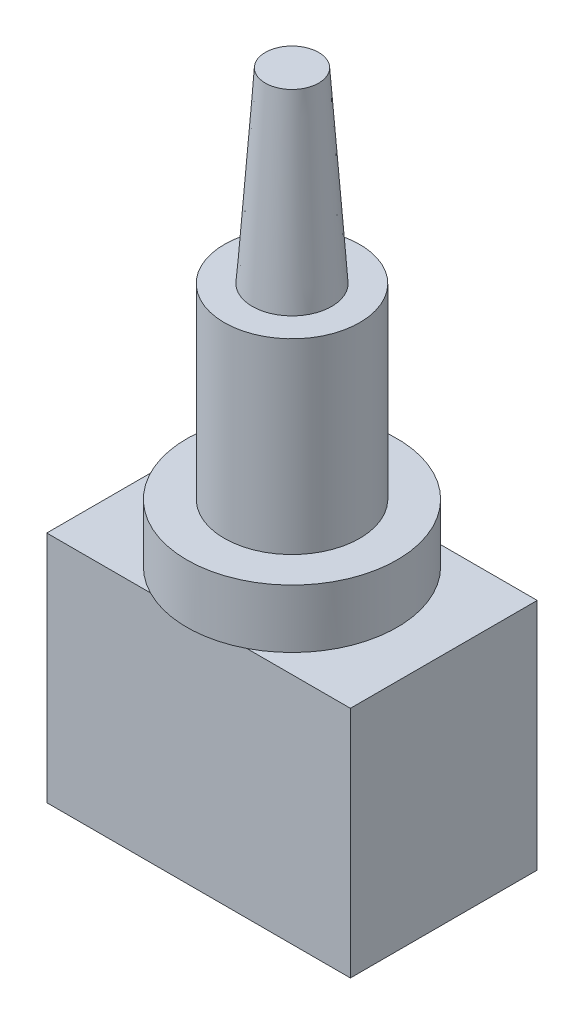
ISO-10303-21;
HEADER;
FILE_DESCRIPTION(('STEP AP214'),'2;1');
FILE_NAME('part.step','',(''),(''),'','','');
FILE_SCHEMA(('AUTOMOTIVE_DESIGN { 1 0 10303 214 1 1 1 1 }'));
ENDSEC;
DATA;
#1=APPLICATION_CONTEXT('core data for automotive mechanical design processes');
#2=APPLICATION_PROTOCOL_DEFINITION('international standard','automotive_design',2000,#1);
#3=PRODUCT_CONTEXT('',#1,'mechanical');
#4=PRODUCT('Part','Part','',(#3));
#5=PRODUCT_RELATED_PRODUCT_CATEGORY('part','',(#4));
#6=PRODUCT_DEFINITION_FORMATION('','',#4);
#7=PRODUCT_DEFINITION_CONTEXT('part definition',#1,'design');
#8=PRODUCT_DEFINITION('design','',#6,#7);
#9=PRODUCT_DEFINITION_SHAPE('','',#8);
#10=(LENGTH_UNIT() NAMED_UNIT(*) SI_UNIT(.MILLI.,.METRE.));
#11=(NAMED_UNIT(*) PLANE_ANGLE_UNIT() SI_UNIT($,.RADIAN.));
#12=(NAMED_UNIT(*) SI_UNIT($,.STERADIAN.) SOLID_ANGLE_UNIT());
#13=UNCERTAINTY_MEASURE_WITH_UNIT(LENGTH_MEASURE(1.E-05),#10,'distance_accuracy_value','');
#14=(GEOMETRIC_REPRESENTATION_CONTEXT(3) GLOBAL_UNCERTAINTY_ASSIGNED_CONTEXT((#13)) GLOBAL_UNIT_ASSIGNED_CONTEXT((#10,
#11,#12)) REPRESENTATION_CONTEXT('',''));
#15=CARTESIAN_POINT('',(0.,0.,0.));
#16=DIRECTION('',(0.,0.,1.));
#17=DIRECTION('',(1.,0.,0.));
#18=AXIS2_PLACEMENT_3D('',#15,#16,#17);
#19=CARTESIAN_POINT('',(0.,10.,0.));
#20=DIRECTION('',(0.,1.,0.));
#21=DIRECTION('',(0.,0.,1.));
#22=AXIS2_PLACEMENT_3D('',#19,#20,#21);
#23=PLANE('',#22);
#24=CARTESIAN_POINT('',(0.,10.,0.));
#25=DIRECTION('',(0.,1.,0.));
#26=DIRECTION('',(0.,0.,1.));
#27=AXIS2_PLACEMENT_3D('',#24,#25,#26);
#28=CIRCLE('',#27,4.5);
#29=CARTESIAN_POINT('',(2.06155281280883,10.,4.));
#30=VERTEX_POINT('',#29);
#31=CARTESIAN_POINT('',(2.06155281280883,10.,-4.));
#32=VERTEX_POINT('',#31);
#33=EDGE_CURVE('E50',#30,#32,#28,.T.);
#34=ORIENTED_EDGE('',*,*,#33,.F.);
#35=DIRECTION('',(1.,0.,0.));
#36=VECTOR('',#35,1.);
#37=CARTESIAN_POINT('',(-6.5,10.,4.));
#38=LINE('',#37,#36);
#39=CARTESIAN_POINT('',(6.5,10.,4.));
#40=VERTEX_POINT('',#39);
#41=EDGE_CURVE('E98',#30,#40,#38,.T.);
#42=ORIENTED_EDGE('',*,*,#41,.T.);
#43=DIRECTION('',(0.,0.,-1.));
#44=VECTOR('',#43,1.);
#45=CARTESIAN_POINT('',(6.5,10.,-4.));
#46=LINE('',#45,#44);
#47=CARTESIAN_POINT('',(6.5,10.,-4.));
#48=VERTEX_POINT('',#47);
#49=EDGE_CURVE('E202',#40,#48,#46,.T.);
#50=ORIENTED_EDGE('',*,*,#49,.T.);
#51=DIRECTION('',(-1.,0.,0.));
#52=VECTOR('',#51,1.);
#53=CARTESIAN_POINT('',(-6.5,10.,-4.));
#54=LINE('',#53,#52);
#55=EDGE_CURVE('E212',#48,#32,#54,.T.);
#56=ORIENTED_EDGE('',*,*,#55,.T.);
#57=EDGE_LOOP('',(#34,#42,#50,#56));
#58=FACE_BOUND('',#57,.T.);
#59=ADVANCED_FACE('F33',(#58),#23,.T.);
#60=CARTESIAN_POINT('',(6.5,10.,-4.));
#61=DIRECTION('',(-1.,0.,0.));
#62=DIRECTION('',(0.,0.,1.));
#63=AXIS2_PLACEMENT_3D('',#60,#61,#62);
#64=PLANE('',#63);
#65=DIRECTION('',(0.,0.,-1.));
#66=VECTOR('',#65,1.);
#67=CARTESIAN_POINT('',(6.5,0.,-4.));
#68=LINE('',#67,#66);
#69=CARTESIAN_POINT('',(6.5,0.,4.));
#70=VERTEX_POINT('',#69);
#71=CARTESIAN_POINT('',(6.5,0.,-4.));
#72=VERTEX_POINT('',#71);
#73=EDGE_CURVE('E122',#70,#72,#68,.T.);
#74=ORIENTED_EDGE('',*,*,#73,.T.);
#75=DIRECTION('',(0.,-1.,0.));
#76=VECTOR('',#75,1.);
#77=CARTESIAN_POINT('',(6.5,10.,-4.));
#78=LINE('',#77,#76);
#79=EDGE_CURVE('E37',#48,#72,#78,.T.);
#80=ORIENTED_EDGE('',*,*,#79,.F.);
#81=ORIENTED_EDGE('',*,*,#49,.F.);
#82=DIRECTION('',(0.,-1.,0.));
#83=VECTOR('',#82,1.);
#84=CARTESIAN_POINT('',(6.5,10.,4.));
#85=LINE('',#84,#83);
#86=EDGE_CURVE('E95',#40,#70,#85,.T.);
#87=ORIENTED_EDGE('',*,*,#86,.T.);
#88=EDGE_LOOP('',(#74,#80,#81,#87));
#89=FACE_BOUND('',#88,.T.);
#90=ADVANCED_FACE('F35',(#89),#64,.F.);
#91=CARTESIAN_POINT('',(-6.5,10.,-4.));
#92=DIRECTION('',(0.,0.,1.));
#93=DIRECTION('',(1.,0.,0.));
#94=AXIS2_PLACEMENT_3D('',#91,#92,#93);
#95=PLANE('',#94);
#96=DIRECTION('',(-1.,0.,0.));
#97=VECTOR('',#96,1.);
#98=CARTESIAN_POINT('',(-6.5,0.,-4.));
#99=LINE('',#98,#97);
#100=CARTESIAN_POINT('',(-6.5,0.,-4.));
#101=VERTEX_POINT('',#100);
#102=EDGE_CURVE('E126',#72,#101,#99,.T.);
#103=ORIENTED_EDGE('',*,*,#102,.T.);
#104=DIRECTION('',(0.,-1.,0.));
#105=VECTOR('',#104,1.);
#106=CARTESIAN_POINT('',(-6.5,10.,-4.));
#107=LINE('',#106,#105);
#108=CARTESIAN_POINT('',(-6.5,10.,-4.));
#109=VERTEX_POINT('',#108);
#110=EDGE_CURVE('E117',#109,#101,#107,.T.);
#111=ORIENTED_EDGE('',*,*,#110,.F.);
#112=CARTESIAN_POINT('',(-2.06155281280883,10.,-4.));
#113=VERTEX_POINT('',#112);
#114=EDGE_CURVE('E209',#113,#109,#54,.T.);
#115=ORIENTED_EDGE('',*,*,#114,.F.);
#116=EDGE_CURVE('E210',#32,#113,#54,.T.);
#117=ORIENTED_EDGE('',*,*,#116,.F.);
#118=ORIENTED_EDGE('',*,*,#55,.F.);
#119=ORIENTED_EDGE('',*,*,#79,.T.);
#120=EDGE_LOOP('',(#103,#111,#115,#117,#118,#119));
#121=FACE_BOUND('',#120,.T.);
#122=ADVANCED_FACE('F169',(#121),#95,.F.);
#123=CARTESIAN_POINT('',(-6.5,10.,-4.));
#124=DIRECTION('',(1.,0.,0.));
#125=DIRECTION('',(0.,0.,-1.));
#126=AXIS2_PLACEMENT_3D('',#123,#124,#125);
#127=PLANE('',#126);
#128=DIRECTION('',(0.,0.,1.));
#129=VECTOR('',#128,1.);
#130=CARTESIAN_POINT('',(-6.5,0.,-4.));
#131=LINE('',#130,#129);
#132=CARTESIAN_POINT('',(-6.5,0.,4.));
#133=VERTEX_POINT('',#132);
#134=EDGE_CURVE('E196',#101,#133,#131,.T.);
#135=ORIENTED_EDGE('',*,*,#134,.T.);
#136=DIRECTION('',(0.,-1.,0.));
#137=VECTOR('',#136,1.);
#138=CARTESIAN_POINT('',(-6.5,10.,4.));
#139=LINE('',#138,#137);
#140=CARTESIAN_POINT('',(-6.5,10.,4.));
#141=VERTEX_POINT('',#140);
#142=EDGE_CURVE('E198',#141,#133,#139,.T.);
#143=ORIENTED_EDGE('',*,*,#142,.F.);
#144=DIRECTION('',(0.,0.,1.));
#145=VECTOR('',#144,1.);
#146=CARTESIAN_POINT('',(-6.5,10.,-4.));
#147=LINE('',#146,#145);
#148=EDGE_CURVE('E91',#109,#141,#147,.T.);
#149=ORIENTED_EDGE('',*,*,#148,.F.);
#150=ORIENTED_EDGE('',*,*,#110,.T.);
#151=EDGE_LOOP('',(#135,#143,#149,#150));
#152=FACE_BOUND('',#151,.T.);
#153=ADVANCED_FACE('F180',(#152),#127,.F.);
#154=CARTESIAN_POINT('',(-6.5,10.,4.));
#155=DIRECTION('',(0.,0.,-1.));
#156=DIRECTION('',(-1.,0.,0.));
#157=AXIS2_PLACEMENT_3D('',#154,#155,#156);
#158=PLANE('',#157);
#159=DIRECTION('',(1.,0.,0.));
#160=VECTOR('',#159,1.);
#161=CARTESIAN_POINT('',(-6.5,0.,4.));
#162=LINE('',#161,#160);
#163=EDGE_CURVE('E200',#133,#70,#162,.T.);
#164=ORIENTED_EDGE('',*,*,#163,.T.);
#165=ORIENTED_EDGE('',*,*,#86,.F.);
#166=ORIENTED_EDGE('',*,*,#41,.F.);
#167=CARTESIAN_POINT('',(-2.06155281280883,10.,4.));
#168=VERTEX_POINT('',#167);
#169=EDGE_CURVE('E96',#168,#30,#38,.T.);
#170=ORIENTED_EDGE('',*,*,#169,.F.);
#171=EDGE_CURVE('E87',#141,#168,#38,.T.);
#172=ORIENTED_EDGE('',*,*,#171,.F.);
#173=ORIENTED_EDGE('',*,*,#142,.T.);
#174=EDGE_LOOP('',(#164,#165,#166,#170,#172,#173));
#175=FACE_BOUND('',#174,.T.);
#176=ADVANCED_FACE('F101',(#175),#158,.F.);
#177=EDGE_CURVE('E58',#113,#168,#28,.T.);
#178=ORIENTED_EDGE('',*,*,#177,.F.);
#179=ORIENTED_EDGE('',*,*,#114,.T.);
#180=ORIENTED_EDGE('',*,*,#148,.T.);
#181=ORIENTED_EDGE('',*,*,#171,.T.);
#182=EDGE_LOOP('',(#178,#179,#180,#181));
#183=FACE_BOUND('',#182,.T.);
#184=ADVANCED_FACE('F89',(#183),#23,.T.);
#185=CARTESIAN_POINT('',(0.,0.,0.));
#186=DIRECTION('',(0.,1.,0.));
#187=DIRECTION('',(0.,0.,1.));
#188=AXIS2_PLACEMENT_3D('',#185,#186,#187);
#189=PLANE('',#188);
#190=ORIENTED_EDGE('',*,*,#73,.F.);
#191=ORIENTED_EDGE('',*,*,#163,.F.);
#192=ORIENTED_EDGE('',*,*,#134,.F.);
#193=ORIENTED_EDGE('',*,*,#102,.F.);
#194=EDGE_LOOP('',(#190,#191,#192,#193));
#195=FACE_BOUND('',#194,.T.);
#196=ADVANCED_FACE('F173',(#195),#189,.F.);
#197=CARTESIAN_POINT('',(0.,10.,0.));
#198=DIRECTION('',(0.,1.,0.));
#199=DIRECTION('',(0.,0.,1.));
#200=AXIS2_PLACEMENT_3D('',#197,#198,#199);
#201=PLANE('',#200);
#202=EDGE_CURVE('E108',#32,#113,#28,.T.);
#203=ORIENTED_EDGE('',*,*,#202,.F.);
#204=ORIENTED_EDGE('',*,*,#116,.T.);
#205=EDGE_LOOP('',(#203,#204));
#206=FACE_BOUND('',#205,.T.);
#207=ADVANCED_FACE('F178',(#206),#201,.F.);
#208=EDGE_CURVE('E105',#168,#30,#28,.T.);
#209=ORIENTED_EDGE('',*,*,#208,.F.);
#210=ORIENTED_EDGE('',*,*,#169,.T.);
#211=EDGE_LOOP('',(#209,#210));
#212=FACE_BOUND('',#211,.T.);
#213=ADVANCED_FACE('F106',(#212),#201,.F.);
#214=CARTESIAN_POINT('',(0.,12.5,0.));
#215=DIRECTION('',(0.,-1.,0.));
#216=DIRECTION('',(0.,0.,-1.));
#217=AXIS2_PLACEMENT_3D('',#214,#215,#216);
#218=CYLINDRICAL_SURFACE('',#217,4.5);
#219=CARTESIAN_POINT('',(0.,12.5,0.));
#220=DIRECTION('',(0.,1.,0.));
#221=DIRECTION('',(0.,0.,1.));
#222=AXIS2_PLACEMENT_3D('',#219,#220,#221);
#223=CIRCLE('',#222,4.5);
#224=CARTESIAN_POINT('',(0.,12.5,4.5));
#225=VERTEX_POINT('',#224);
#226=EDGE_CURVE('E120',#225,#225,#223,.T.);
#227=ORIENTED_EDGE('',*,*,#226,.F.);
#228=EDGE_LOOP('',(#227));
#229=FACE_BOUND('',#228,.T.);
#230=ORIENTED_EDGE('',*,*,#33,.T.);
#231=ORIENTED_EDGE('',*,*,#202,.T.);
#232=ORIENTED_EDGE('',*,*,#177,.T.);
#233=ORIENTED_EDGE('',*,*,#208,.T.);
#234=EDGE_LOOP('',(#230,#231,#232,#233));
#235=FACE_BOUND('',#234,.T.);
#236=ADVANCED_FACE('F112',(#229,#235),#218,.T.);
#237=CARTESIAN_POINT('',(0.,12.5,0.));
#238=DIRECTION('',(0.,1.,0.));
#239=DIRECTION('',(0.,0.,1.));
#240=AXIS2_PLACEMENT_3D('',#237,#238,#239);
#241=PLANE('',#240);
#242=CARTESIAN_POINT('',(0.,12.5,0.));
#243=DIRECTION('',(0.,1.,0.));
#244=DIRECTION('',(0.,0.,1.));
#245=AXIS2_PLACEMENT_3D('',#242,#243,#244);
#246=CIRCLE('',#245,2.9);
#247=CARTESIAN_POINT('',(0.,12.5,2.9));
#248=VERTEX_POINT('',#247);
#249=EDGE_CURVE('E42',#248,#248,#246,.T.);
#250=ORIENTED_EDGE('',*,*,#249,.F.);
#251=EDGE_LOOP('',(#250));
#252=FACE_BOUND('',#251,.T.);
#253=ORIENTED_EDGE('',*,*,#226,.T.);
#254=EDGE_LOOP('',(#253));
#255=FACE_BOUND('',#254,.T.);
#256=ADVANCED_FACE('F152',(#252,#255),#241,.T.);
#257=CARTESIAN_POINT('',(0.,20.5,0.));
#258=DIRECTION('',(0.,-1.,0.));
#259=DIRECTION('',(0.,0.,-1.));
#260=AXIS2_PLACEMENT_3D('',#257,#258,#259);
#261=CYLINDRICAL_SURFACE('',#260,2.9);
#262=CARTESIAN_POINT('',(0.,20.5,0.));
#263=DIRECTION('',(0.,1.,0.));
#264=DIRECTION('',(0.,0.,1.));
#265=AXIS2_PLACEMENT_3D('',#262,#263,#264);
#266=CIRCLE('',#265,2.9);
#267=CARTESIAN_POINT('',(0.,20.5,2.9));
#268=VERTEX_POINT('',#267);
#269=EDGE_CURVE('E109',#268,#268,#266,.T.);
#270=ORIENTED_EDGE('',*,*,#269,.F.);
#271=EDGE_LOOP('',(#270));
#272=FACE_BOUND('',#271,.T.);
#273=ORIENTED_EDGE('',*,*,#249,.T.);
#274=EDGE_LOOP('',(#273));
#275=FACE_BOUND('',#274,.T.);
#276=ADVANCED_FACE('F146',(#272,#275),#261,.T.);
#277=CARTESIAN_POINT('',(0.,20.5,0.));
#278=DIRECTION('',(0.,1.,0.));
#279=DIRECTION('',(0.,0.,1.));
#280=AXIS2_PLACEMENT_3D('',#277,#278,#279);
#281=PLANE('',#280);
#282=CARTESIAN_POINT('',(0.,20.5,0.));
#283=DIRECTION('',(0.,1.,0.));
#284=DIRECTION('',(0.,0.,1.));
#285=AXIS2_PLACEMENT_3D('',#282,#283,#284);
#286=CIRCLE('',#285,1.7);
#287=CARTESIAN_POINT('',(0.,20.5,1.7));
#288=VERTEX_POINT('',#287);
#289=EDGE_CURVE('E11',#288,#288,#286,.T.);
#290=ORIENTED_EDGE('',*,*,#289,.F.);
#291=EDGE_LOOP('',(#290));
#292=FACE_BOUND('',#291,.T.);
#293=ORIENTED_EDGE('',*,*,#269,.T.);
#294=EDGE_LOOP('',(#293));
#295=FACE_BOUND('',#294,.T.);
#296=ADVANCED_FACE('F140',(#292,#295),#281,.T.);
#297=CARTESIAN_POINT('',(0.,20.5,0.));
#298=DIRECTION('',(0.,-1.,0.));
#299=DIRECTION('',(0.,0.,1.));
#300=AXIS2_PLACEMENT_3D('',#297,#298,#299);
#301=CONICAL_SURFACE('',#300,1.7,0.0698131700797732);
#302=CARTESIAN_POINT('',(0.,28.5,0.));
#303=DIRECTION('',(0.,1.,0.));
#304=DIRECTION('',(0.,0.,1.));
#305=AXIS2_PLACEMENT_3D('',#302,#303,#304);
#306=CIRCLE('',#305,1.14058550445192);
#307=CARTESIAN_POINT('',(0.,28.5,1.14058550445192));
#308=VERTEX_POINT('',#307);
#309=EDGE_CURVE('E131',#308,#308,#306,.T.);
#310=ORIENTED_EDGE('',*,*,#309,.F.);
#311=EDGE_LOOP('',(#310));
#312=FACE_BOUND('',#311,.T.);
#313=ORIENTED_EDGE('',*,*,#289,.T.);
#314=EDGE_LOOP('',(#313));
#315=FACE_BOUND('',#314,.T.);
#316=ADVANCED_FACE('F137',(#312,#315),#301,.T.);
#317=CARTESIAN_POINT('',(0.,28.5,0.));
#318=DIRECTION('',(0.,1.,0.));
#319=DIRECTION('',(0.,0.,1.));
#320=AXIS2_PLACEMENT_3D('',#317,#318,#319);
#321=PLANE('',#320);
#322=ORIENTED_EDGE('',*,*,#309,.T.);
#323=EDGE_LOOP('',(#322));
#324=FACE_BOUND('',#323,.T.);
#325=ADVANCED_FACE('F135',(#324),#321,.T.);
#326=CLOSED_SHELL('',(#59,#90,#122,#153,#176,#184,#196,#207,#213,#236,#256,#276,#296,#316,#325));
#327=MANIFOLD_SOLID_BREP('B2',#326);
#328=ADVANCED_BREP_SHAPE_REPRESENTATION('',(#18,#327),#14);
#329=SHAPE_DEFINITION_REPRESENTATION(#9,#328);
ENDSEC;
END-ISO-10303-21;
